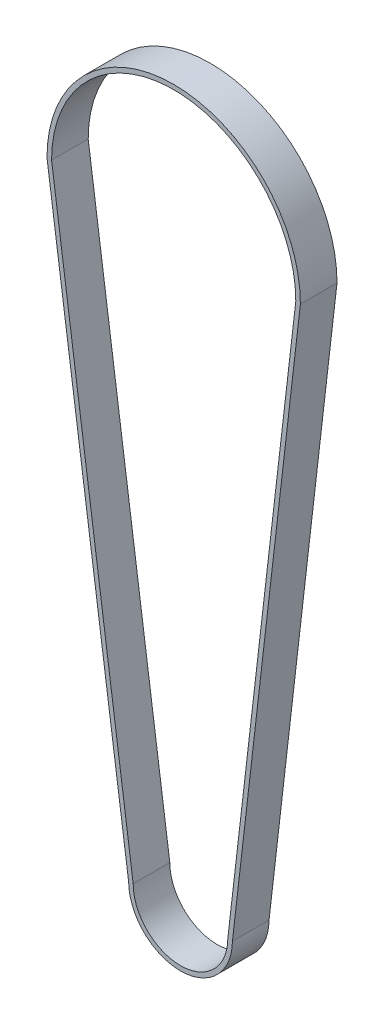
ISO-10303-21;
HEADER;
FILE_DESCRIPTION(('STEP AP214'),'2;1');
FILE_NAME('part.step','',(''),(''),'','','');
FILE_SCHEMA(('AUTOMOTIVE_DESIGN { 1 0 10303 214 1 1 1 1 }'));
ENDSEC;
DATA;
#1=APPLICATION_CONTEXT('core data for automotive mechanical design processes');
#2=APPLICATION_PROTOCOL_DEFINITION('international standard','automotive_design',2000,#1);
#3=PRODUCT_CONTEXT('',#1,'mechanical');
#4=PRODUCT('Part','Part','',(#3));
#5=PRODUCT_RELATED_PRODUCT_CATEGORY('part','',(#4));
#6=PRODUCT_DEFINITION_FORMATION('','',#4);
#7=PRODUCT_DEFINITION_CONTEXT('part definition',#1,'design');
#8=PRODUCT_DEFINITION('design','',#6,#7);
#9=PRODUCT_DEFINITION_SHAPE('','',#8);
#10=(LENGTH_UNIT() NAMED_UNIT(*) SI_UNIT(.MILLI.,.METRE.));
#11=(NAMED_UNIT(*) PLANE_ANGLE_UNIT() SI_UNIT($,.RADIAN.));
#12=(NAMED_UNIT(*) SI_UNIT($,.STERADIAN.) SOLID_ANGLE_UNIT());
#13=UNCERTAINTY_MEASURE_WITH_UNIT(LENGTH_MEASURE(1.E-05),#10,'distance_accuracy_value','');
#14=(GEOMETRIC_REPRESENTATION_CONTEXT(3) GLOBAL_UNCERTAINTY_ASSIGNED_CONTEXT((#13)) GLOBAL_UNIT_ASSIGNED_CONTEXT((#10,
#11,#12)) REPRESENTATION_CONTEXT('',''));
#15=CARTESIAN_POINT('',(0.,0.,0.));
#16=DIRECTION('',(0.,0.,1.));
#17=DIRECTION('',(1.,0.,0.));
#18=AXIS2_PLACEMENT_3D('',#15,#16,#17);
#19=CARTESIAN_POINT('',(-2.96616628629004,46.7523420364244,6.));
#20=DIRECTION('',(0.,0.,-1.));
#21=DIRECTION('',(-1.,0.,0.));
#22=AXIS2_PLACEMENT_3D('',#19,#20,#21);
#23=PLANE('',#22);
#24=CARTESIAN_POINT('',(-2.96616628629004,46.7523420364244,6.));
#25=DIRECTION('',(0.,0.,1.));
#26=DIRECTION('',(-1.,0.,0.));
#27=AXIS2_PLACEMENT_3D('',#24,#25,#26);
#28=CIRCLE('',#27,20.75);
#29=CARTESIAN_POINT('',(17.7837875522046,46.7085733222271,6.));
#30=VERTEX_POINT('',#29);
#31=CARTESIAN_POINT('',(-23.7160999511697,46.6998739213917,6.));
#32=VERTEX_POINT('',#31);
#33=EDGE_CURVE('E140',#30,#32,#28,.T.);
#34=ORIENTED_EDGE('',*,*,#33,.T.);
#35=DIRECTION('',(0.137982141735871,-0.990434716961185,0.));
#36=VECTOR('',#35,1.);
#37=CARTESIAN_POINT('',(-23.7160999511697,46.6998739213917,6.));
#38=LINE('',#37,#36);
#39=CARTESIAN_POINT('',(-10.3496548204168,-49.2443630161394,6.));
#40=VERTEX_POINT('',#39);
#41=EDGE_CURVE('E143',#32,#40,#38,.T.);
#42=ORIENTED_EDGE('',*,*,#41,.T.);
#43=CARTESIAN_POINT('',(-1.84982122156857,-49.1911766279267,6.));
#44=DIRECTION('',(0.,0.,1.));
#45=DIRECTION('',(1.,0.,0.));
#46=AXIS2_PLACEMENT_3D('',#43,#44,#45);
#47=CIRCLE('',#46,8.50000000000004);
#48=CARTESIAN_POINT('',(6.65006297809096,-49.2355454500755,6.));
#49=VERTEX_POINT('',#48);
#50=EDGE_CURVE('E146',#40,#49,#47,.T.);
#51=ORIENTED_EDGE('',*,*,#50,.T.);
#52=DIRECTION('',(0.115270316646928,0.993334160340878,0.));
#53=VECTOR('',#52,1.);
#54=CARTESIAN_POINT('',(17.7837875522046,46.7085733222271,6.));
#55=LINE('',#54,#53);
#56=EDGE_CURVE('E148',#49,#30,#55,.T.);
#57=ORIENTED_EDGE('',*,*,#56,.T.);
#58=EDGE_LOOP('',(#34,#42,#51,#57));
#59=FACE_BOUND('',#58,.T.);
#60=CARTESIAN_POINT('',(-2.96616628629004,46.7523420364244,6.));
#61=DIRECTION('',(0.,0.,1.));
#62=DIRECTION('',(-1.,0.,0.));
#63=AXIS2_PLACEMENT_3D('',#60,#61,#62);
#64=CIRCLE('',#63,20.);
#65=CARTESIAN_POINT('',(17.03383371371,46.7523420364225,6.));
#66=VERTEX_POINT('',#65);
#67=CARTESIAN_POINT('',(-22.9661662862901,46.752342036426,6.));
#68=VERTEX_POINT('',#67);
#69=EDGE_CURVE('E104',#66,#68,#64,.T.);
#70=ORIENTED_EDGE('',*,*,#69,.F.);
#71=DIRECTION('',(0.115270316646928,0.993334160340878,0.));
#72=VECTOR('',#71,1.);
#73=CARTESIAN_POINT('',(17.03383371371,46.7523420364225,6.));
#74=LINE('',#73,#72);
#75=CARTESIAN_POINT('',(5.90017877843146,-49.1911766279267,6.));
#76=VERTEX_POINT('',#75);
#77=EDGE_CURVE('E126',#76,#66,#74,.T.);
#78=ORIENTED_EDGE('',*,*,#77,.F.);
#79=CARTESIAN_POINT('',(-1.84982122156857,-49.1911766279267,6.));
#80=DIRECTION('',(0.,0.,1.));
#81=DIRECTION('',(1.,0.,0.));
#82=AXIS2_PLACEMENT_3D('',#79,#80,#81);
#83=CIRCLE('',#82,7.75000000000003);
#84=CARTESIAN_POINT('',(-9.59982122156861,-49.1911766279267,6.));
#85=VERTEX_POINT('',#84);
#86=EDGE_CURVE('E124',#85,#76,#83,.T.);
#87=ORIENTED_EDGE('',*,*,#86,.F.);
#88=DIRECTION('',(0.137982141735871,-0.990434716961185,0.));
#89=VECTOR('',#88,1.);
#90=CARTESIAN_POINT('',(-22.9661662862901,46.752342036426,6.));
#91=LINE('',#90,#89);
#92=EDGE_CURVE('E112',#68,#85,#91,.T.);
#93=ORIENTED_EDGE('',*,*,#92,.F.);
#94=EDGE_LOOP('',(#70,#78,#87,#93));
#95=FACE_BOUND('',#94,.T.);
#96=ADVANCED_FACE('F39',(#59,#95),#23,.F.);
#97=CARTESIAN_POINT('',(-2.96616628629004,46.7523420364244,0.));
#98=DIRECTION('',(0.,0.,-1.));
#99=DIRECTION('',(-1.,0.,0.));
#100=AXIS2_PLACEMENT_3D('',#97,#98,#99);
#101=PLANE('',#100);
#102=CARTESIAN_POINT('',(-2.96616628629004,46.7523420364244,0.));
#103=DIRECTION('',(0.,0.,1.));
#104=DIRECTION('',(-1.,0.,0.));
#105=AXIS2_PLACEMENT_3D('',#102,#103,#104);
#106=CIRCLE('',#105,20.75);
#107=CARTESIAN_POINT('',(17.7837875522046,46.7085733222271,0.));
#108=VERTEX_POINT('',#107);
#109=CARTESIAN_POINT('',(-23.7160999511697,46.6998739213917,0.));
#110=VERTEX_POINT('',#109);
#111=EDGE_CURVE('E120',#108,#110,#106,.T.);
#112=ORIENTED_EDGE('',*,*,#111,.F.);
#113=DIRECTION('',(0.115270316646928,0.993334160340878,0.));
#114=VECTOR('',#113,1.);
#115=CARTESIAN_POINT('',(17.7837875522046,46.7085733222271,0.));
#116=LINE('',#115,#114);
#117=CARTESIAN_POINT('',(6.65006297809096,-49.2355454500755,0.));
#118=VERTEX_POINT('',#117);
#119=EDGE_CURVE('E144',#118,#108,#116,.T.);
#120=ORIENTED_EDGE('',*,*,#119,.F.);
#121=CARTESIAN_POINT('',(-1.84982122156857,-49.1911766279267,0.));
#122=DIRECTION('',(0.,0.,1.));
#123=DIRECTION('',(1.,0.,0.));
#124=AXIS2_PLACEMENT_3D('',#121,#122,#123);
#125=CIRCLE('',#124,8.50000000000004);
#126=CARTESIAN_POINT('',(-10.3496548204168,-49.2443630161394,0.));
#127=VERTEX_POINT('',#126);
#128=EDGE_CURVE('E155',#127,#118,#125,.T.);
#129=ORIENTED_EDGE('',*,*,#128,.F.);
#130=DIRECTION('',(0.137982141735871,-0.990434716961185,0.));
#131=VECTOR('',#130,1.);
#132=CARTESIAN_POINT('',(-23.7160999511697,46.6998739213917,0.));
#133=LINE('',#132,#131);
#134=EDGE_CURVE('E153',#110,#127,#133,.T.);
#135=ORIENTED_EDGE('',*,*,#134,.F.);
#136=EDGE_LOOP('',(#112,#120,#129,#135));
#137=FACE_BOUND('',#136,.T.);
#138=DIRECTION('',(0.115270316646928,0.993334160340878,0.));
#139=VECTOR('',#138,1.);
#140=CARTESIAN_POINT('',(17.03383371371,46.7523420364225,0.));
#141=LINE('',#140,#139);
#142=CARTESIAN_POINT('',(5.90017877843146,-49.1911766279267,0.));
#143=VERTEX_POINT('',#142);
#144=CARTESIAN_POINT('',(17.03383371371,46.7523420364225,0.));
#145=VERTEX_POINT('',#144);
#146=EDGE_CURVE('E113',#143,#145,#141,.T.);
#147=ORIENTED_EDGE('',*,*,#146,.T.);
#148=CARTESIAN_POINT('',(-2.96616628629004,46.7523420364244,0.));
#149=DIRECTION('',(0.,0.,1.));
#150=DIRECTION('',(-1.,0.,0.));
#151=AXIS2_PLACEMENT_3D('',#148,#149,#150);
#152=CIRCLE('',#151,20.);
#153=CARTESIAN_POINT('',(-22.9661662862901,46.752342036426,0.));
#154=VERTEX_POINT('',#153);
#155=EDGE_CURVE('E62',#145,#154,#152,.T.);
#156=ORIENTED_EDGE('',*,*,#155,.T.);
#157=DIRECTION('',(0.137982141735871,-0.990434716961185,0.));
#158=VECTOR('',#157,1.);
#159=CARTESIAN_POINT('',(-22.9661662862901,46.752342036426,0.));
#160=LINE('',#159,#158);
#161=CARTESIAN_POINT('',(-9.59982122156861,-49.1911766279267,0.));
#162=VERTEX_POINT('',#161);
#163=EDGE_CURVE('E119',#154,#162,#160,.T.);
#164=ORIENTED_EDGE('',*,*,#163,.T.);
#165=CARTESIAN_POINT('',(-1.84982122156857,-49.1911766279267,0.));
#166=DIRECTION('',(0.,0.,1.));
#167=DIRECTION('',(1.,0.,0.));
#168=AXIS2_PLACEMENT_3D('',#165,#166,#167);
#169=CIRCLE('',#168,7.75000000000003);
#170=EDGE_CURVE('E132',#162,#143,#169,.T.);
#171=ORIENTED_EDGE('',*,*,#170,.T.);
#172=EDGE_LOOP('',(#147,#156,#164,#171));
#173=FACE_BOUND('',#172,.T.);
#174=ADVANCED_FACE('F173',(#137,#173),#101,.T.);
#175=CARTESIAN_POINT('',(-2.96616628629004,46.7523420364244,6.));
#176=DIRECTION('',(0.,0.,-1.));
#177=DIRECTION('',(-1.,0.,0.));
#178=AXIS2_PLACEMENT_3D('',#175,#176,#177);
#179=CYLINDRICAL_SURFACE('',#178,20.75);
#180=ORIENTED_EDGE('',*,*,#111,.T.);
#181=DIRECTION('',(0.,0.,-1.));
#182=VECTOR('',#181,1.);
#183=CARTESIAN_POINT('',(-23.7160999511697,46.6998739213917,6.));
#184=LINE('',#183,#182);
#185=EDGE_CURVE('E11',#32,#110,#184,.T.);
#186=ORIENTED_EDGE('',*,*,#185,.F.);
#187=ORIENTED_EDGE('',*,*,#33,.F.);
#188=DIRECTION('',(0.,0.,-1.));
#189=VECTOR('',#188,1.);
#190=CARTESIAN_POINT('',(17.7837875522046,46.7085733222271,6.));
#191=LINE('',#190,#189);
#192=EDGE_CURVE('E150',#30,#108,#191,.T.);
#193=ORIENTED_EDGE('',*,*,#192,.T.);
#194=EDGE_LOOP('',(#180,#186,#187,#193));
#195=FACE_BOUND('',#194,.T.);
#196=ADVANCED_FACE('F41',(#195),#179,.T.);
#197=CARTESIAN_POINT('',(-23.7160999511697,46.6998739213917,6.));
#198=DIRECTION('',(0.990434716961185,0.137982141735871,0.));
#199=DIRECTION('',(-0.137982141735871,0.990434716961185,0.));
#200=AXIS2_PLACEMENT_3D('',#197,#198,#199);
#201=PLANE('',#200);
#202=ORIENTED_EDGE('',*,*,#134,.T.);
#203=DIRECTION('',(0.,0.,-1.));
#204=VECTOR('',#203,1.);
#205=CARTESIAN_POINT('',(-10.3496548204168,-49.2443630161394,6.));
#206=LINE('',#205,#204);
#207=EDGE_CURVE('E47',#40,#127,#206,.T.);
#208=ORIENTED_EDGE('',*,*,#207,.F.);
#209=ORIENTED_EDGE('',*,*,#41,.F.);
#210=ORIENTED_EDGE('',*,*,#185,.T.);
#211=EDGE_LOOP('',(#202,#208,#209,#210));
#212=FACE_BOUND('',#211,.T.);
#213=ADVANCED_FACE('F183',(#212),#201,.F.);
#214=CARTESIAN_POINT('',(-1.84982122156857,-49.1911766279267,6.));
#215=DIRECTION('',(0.,0.,-1.));
#216=DIRECTION('',(-1.,0.,0.));
#217=AXIS2_PLACEMENT_3D('',#214,#215,#216);
#218=CYLINDRICAL_SURFACE('',#217,8.50000000000004);
#219=ORIENTED_EDGE('',*,*,#128,.T.);
#220=DIRECTION('',(0.,0.,-1.));
#221=VECTOR('',#220,1.);
#222=CARTESIAN_POINT('',(6.65006297809096,-49.2355454500755,6.));
#223=LINE('',#222,#221);
#224=EDGE_CURVE('E160',#49,#118,#223,.T.);
#225=ORIENTED_EDGE('',*,*,#224,.F.);
#226=ORIENTED_EDGE('',*,*,#50,.F.);
#227=ORIENTED_EDGE('',*,*,#207,.T.);
#228=EDGE_LOOP('',(#219,#225,#226,#227));
#229=FACE_BOUND('',#228,.T.);
#230=ADVANCED_FACE('F167',(#229),#218,.T.);
#231=CARTESIAN_POINT('',(17.7837875522046,46.7085733222271,6.));
#232=DIRECTION('',(-0.993334160340878,0.115270316646928,0.));
#233=DIRECTION('',(-0.115270316646928,-0.993334160340878,0.));
#234=AXIS2_PLACEMENT_3D('',#231,#232,#233);
#235=PLANE('',#234);
#236=ORIENTED_EDGE('',*,*,#119,.T.);
#237=ORIENTED_EDGE('',*,*,#192,.F.);
#238=ORIENTED_EDGE('',*,*,#56,.F.);
#239=ORIENTED_EDGE('',*,*,#224,.T.);
#240=EDGE_LOOP('',(#236,#237,#238,#239));
#241=FACE_BOUND('',#240,.T.);
#242=ADVANCED_FACE('F177',(#241),#235,.F.);
#243=CARTESIAN_POINT('',(-2.96616628629004,46.7523420364244,6.));
#244=DIRECTION('',(0.,0.,-1.));
#245=DIRECTION('',(-1.,0.,0.));
#246=AXIS2_PLACEMENT_3D('',#243,#244,#245);
#247=CYLINDRICAL_SURFACE('',#246,20.);
#248=ORIENTED_EDGE('',*,*,#155,.F.);
#249=DIRECTION('',(0.,0.,-1.));
#250=VECTOR('',#249,1.);
#251=CARTESIAN_POINT('',(17.03383371371,46.7523420364225,6.));
#252=LINE('',#251,#250);
#253=EDGE_CURVE('E108',#66,#145,#252,.T.);
#254=ORIENTED_EDGE('',*,*,#253,.F.);
#255=ORIENTED_EDGE('',*,*,#69,.T.);
#256=DIRECTION('',(0.,0.,-1.));
#257=VECTOR('',#256,1.);
#258=CARTESIAN_POINT('',(-22.9661662862901,46.752342036426,6.));
#259=LINE('',#258,#257);
#260=EDGE_CURVE('E107',#68,#154,#259,.T.);
#261=ORIENTED_EDGE('',*,*,#260,.T.);
#262=EDGE_LOOP('',(#248,#254,#255,#261));
#263=FACE_BOUND('',#262,.T.);
#264=ADVANCED_FACE('F106',(#263),#247,.F.);
#265=CARTESIAN_POINT('',(-22.9661662862901,46.752342036426,6.));
#266=DIRECTION('',(0.990434716961185,0.137982141735871,0.));
#267=DIRECTION('',(-0.137982141735871,0.990434716961185,0.));
#268=AXIS2_PLACEMENT_3D('',#265,#266,#267);
#269=PLANE('',#268);
#270=ORIENTED_EDGE('',*,*,#163,.F.);
#271=ORIENTED_EDGE('',*,*,#260,.F.);
#272=ORIENTED_EDGE('',*,*,#92,.T.);
#273=DIRECTION('',(0.,0.,-1.));
#274=VECTOR('',#273,1.);
#275=CARTESIAN_POINT('',(-9.59982122156861,-49.1911766279267,6.));
#276=LINE('',#275,#274);
#277=EDGE_CURVE('E121',#85,#162,#276,.T.);
#278=ORIENTED_EDGE('',*,*,#277,.T.);
#279=EDGE_LOOP('',(#270,#271,#272,#278));
#280=FACE_BOUND('',#279,.T.);
#281=ADVANCED_FACE('F116',(#280),#269,.T.);
#282=CARTESIAN_POINT('',(-1.84982122156857,-49.1911766279267,6.));
#283=DIRECTION('',(0.,0.,-1.));
#284=DIRECTION('',(-1.,0.,0.));
#285=AXIS2_PLACEMENT_3D('',#282,#283,#284);
#286=CYLINDRICAL_SURFACE('',#285,7.75000000000003);
#287=ORIENTED_EDGE('',*,*,#170,.F.);
#288=ORIENTED_EDGE('',*,*,#277,.F.);
#289=ORIENTED_EDGE('',*,*,#86,.T.);
#290=DIRECTION('',(0.,0.,-1.));
#291=VECTOR('',#290,1.);
#292=CARTESIAN_POINT('',(5.90017877843146,-49.1911766279267,6.));
#293=LINE('',#292,#291);
#294=EDGE_CURVE('E54',#76,#143,#293,.T.);
#295=ORIENTED_EDGE('',*,*,#294,.T.);
#296=EDGE_LOOP('',(#287,#288,#289,#295));
#297=FACE_BOUND('',#296,.T.);
#298=ADVANCED_FACE('F206',(#297),#286,.F.);
#299=CARTESIAN_POINT('',(17.03383371371,46.7523420364225,6.));
#300=DIRECTION('',(-0.993334160340878,0.115270316646928,0.));
#301=DIRECTION('',(-0.115270316646928,-0.993334160340878,0.));
#302=AXIS2_PLACEMENT_3D('',#299,#300,#301);
#303=PLANE('',#302);
#304=ORIENTED_EDGE('',*,*,#146,.F.);
#305=ORIENTED_EDGE('',*,*,#294,.F.);
#306=ORIENTED_EDGE('',*,*,#77,.T.);
#307=ORIENTED_EDGE('',*,*,#253,.T.);
#308=EDGE_LOOP('',(#304,#305,#306,#307));
#309=FACE_BOUND('',#308,.T.);
#310=ADVANCED_FACE('F210',(#309),#303,.T.);
#311=CLOSED_SHELL('',(#96,#174,#196,#213,#230,#242,#264,#281,#298,#310));
#312=MANIFOLD_SOLID_BREP('B2',#311);
#313=ADVANCED_BREP_SHAPE_REPRESENTATION('',(#18,#312),#14);
#314=SHAPE_DEFINITION_REPRESENTATION(#9,#313);
ENDSEC;
END-ISO-10303-21;
